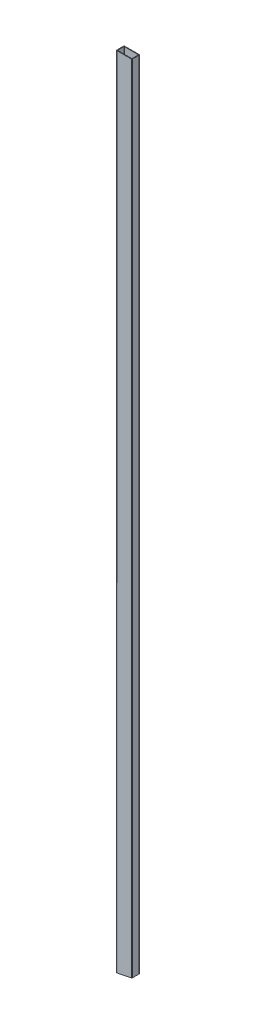
ISO-10303-21;
HEADER;
FILE_DESCRIPTION(('STEP AP214'),'2;1');
FILE_NAME('part.step','',(''),(''),'','','');
FILE_SCHEMA(('AUTOMOTIVE_DESIGN { 1 0 10303 214 1 1 1 1 }'));
ENDSEC;
DATA;
#1=APPLICATION_CONTEXT('core data for automotive mechanical design processes');
#2=APPLICATION_PROTOCOL_DEFINITION('international standard','automotive_design',2000,#1);
#3=PRODUCT_CONTEXT('',#1,'mechanical');
#4=PRODUCT('Part','Part','',(#3));
#5=PRODUCT_RELATED_PRODUCT_CATEGORY('part','',(#4));
#6=PRODUCT_DEFINITION_FORMATION('','',#4);
#7=PRODUCT_DEFINITION_CONTEXT('part definition',#1,'design');
#8=PRODUCT_DEFINITION('design','',#6,#7);
#9=PRODUCT_DEFINITION_SHAPE('','',#8);
#10=(LENGTH_UNIT() NAMED_UNIT(*) SI_UNIT(.MILLI.,.METRE.));
#11=(NAMED_UNIT(*) PLANE_ANGLE_UNIT() SI_UNIT($,.RADIAN.));
#12=(NAMED_UNIT(*) SI_UNIT($,.STERADIAN.) SOLID_ANGLE_UNIT());
#13=UNCERTAINTY_MEASURE_WITH_UNIT(LENGTH_MEASURE(1.E-05),#10,'distance_accuracy_value','');
#14=(GEOMETRIC_REPRESENTATION_CONTEXT(3) GLOBAL_UNCERTAINTY_ASSIGNED_CONTEXT((#13)) GLOBAL_UNIT_ASSIGNED_CONTEXT((#10,
#11,#12)) REPRESENTATION_CONTEXT('',''));
#15=CARTESIAN_POINT('',(0.,0.,0.));
#16=DIRECTION('',(0.,0.,1.));
#17=DIRECTION('',(1.,0.,0.));
#18=AXIS2_PLACEMENT_3D('',#15,#16,#17);
#19=CARTESIAN_POINT('',(-1.50000000000003,2039.60780543711,8.49999999999993));
#20=DIRECTION('',(0.,-1.,0.));
#21=DIRECTION('',(0.,0.,-1.));
#22=AXIS2_PLACEMENT_3D('',#19,#20,#21);
#23=PLANE('',#22);
#24=CARTESIAN_POINT('',(-1.50000000000003,2039.60780543711,8.49999999999993));
#25=DIRECTION('',(0.,1.,0.));
#26=DIRECTION('',(0.,0.,-1.));
#27=AXIS2_PLACEMENT_3D('',#24,#25,#26);
#28=CIRCLE('',#27,1.5);
#29=CARTESIAN_POINT('',(-1.50000000000003,2039.60780543711,9.99999999999993));
#30=VERTEX_POINT('',#29);
#31=CARTESIAN_POINT('',(0.,2039.60780543711,8.49999999999991));
#32=VERTEX_POINT('',#31);
#33=EDGE_CURVE('E134',#30,#32,#28,.T.);
#34=ORIENTED_EDGE('',*,*,#33,.T.);
#35=DIRECTION('',(0.,0.,-1.));
#36=VECTOR('',#35,1.);
#37=CARTESIAN_POINT('',(0.,2039.60780543711,-8.50000000000007));
#38=LINE('',#37,#36);
#39=CARTESIAN_POINT('',(0.,2039.60780543711,-8.50000000000007));
#40=VERTEX_POINT('',#39);
#41=EDGE_CURVE('E155',#32,#40,#38,.T.);
#42=ORIENTED_EDGE('',*,*,#41,.T.);
#43=CARTESIAN_POINT('',(-1.50000000000003,2039.60780543711,-8.50000000000007));
#44=DIRECTION('',(0.,1.,0.));
#45=DIRECTION('',(0.,0.,-1.));
#46=AXIS2_PLACEMENT_3D('',#43,#44,#45);
#47=CIRCLE('',#46,1.50000000000001);
#48=CARTESIAN_POINT('',(-1.50000000000003,2039.60780543711,-10.0000000000001));
#49=VERTEX_POINT('',#48);
#50=EDGE_CURVE('E152',#40,#49,#47,.T.);
#51=ORIENTED_EDGE('',*,*,#50,.T.);
#52=DIRECTION('',(-1.,0.,0.));
#53=VECTOR('',#52,1.);
#54=CARTESIAN_POINT('',(-1.50000000000003,2039.60780543711,-10.0000000000001));
#55=LINE('',#54,#53);
#56=CARTESIAN_POINT('',(-38.5,2039.60780543711,-10.0000000000001));
#57=VERTEX_POINT('',#56);
#58=EDGE_CURVE('E223',#49,#57,#55,.T.);
#59=ORIENTED_EDGE('',*,*,#58,.T.);
#60=CARTESIAN_POINT('',(-38.5,2039.60780543711,-8.50000000000007));
#61=DIRECTION('',(0.,1.,0.));
#62=DIRECTION('',(0.,0.,1.));
#63=AXIS2_PLACEMENT_3D('',#60,#61,#62);
#64=CIRCLE('',#63,1.5);
#65=CARTESIAN_POINT('',(-40.,2039.60780543711,-8.50000000000007));
#66=VERTEX_POINT('',#65);
#67=EDGE_CURVE('E107',#57,#66,#64,.T.);
#68=ORIENTED_EDGE('',*,*,#67,.T.);
#69=DIRECTION('',(0.,0.,1.));
#70=VECTOR('',#69,1.);
#71=CARTESIAN_POINT('',(-40.,2039.60780543711,-8.50000000000007));
#72=LINE('',#71,#70);
#73=CARTESIAN_POINT('',(-40.,2039.60780543711,8.49999999999991));
#74=VERTEX_POINT('',#73);
#75=EDGE_CURVE('E100',#66,#74,#72,.T.);
#76=ORIENTED_EDGE('',*,*,#75,.T.);
#77=CARTESIAN_POINT('',(-38.5,2039.60780543711,8.49999999999994));
#78=DIRECTION('',(0.,1.,0.));
#79=DIRECTION('',(0.,0.,-1.));
#80=AXIS2_PLACEMENT_3D('',#77,#78,#79);
#81=CIRCLE('',#80,1.5);
#82=CARTESIAN_POINT('',(-38.5,2039.60780543711,9.99999999999994));
#83=VERTEX_POINT('',#82);
#84=EDGE_CURVE('E104',#74,#83,#81,.T.);
#85=ORIENTED_EDGE('',*,*,#84,.T.);
#86=DIRECTION('',(1.,0.,0.));
#87=VECTOR('',#86,1.);
#88=CARTESIAN_POINT('',(-1.50000000000003,2039.60780543711,9.99999999999993));
#89=LINE('',#88,#87);
#90=EDGE_CURVE('E59',#83,#30,#89,.T.);
#91=ORIENTED_EDGE('',*,*,#90,.T.);
#92=EDGE_LOOP('',(#34,#42,#51,#59,#68,#76,#85,#91));
#93=FACE_BOUND('',#92,.T.);
#94=CARTESIAN_POINT('',(-37.5,2039.60780543711,7.49999999999994));
#95=DIRECTION('',(0.,1.,0.));
#96=DIRECTION('',(0.,0.,-1.));
#97=AXIS2_PLACEMENT_3D('',#94,#95,#96);
#98=CIRCLE('',#97,0.999999999999994);
#99=CARTESIAN_POINT('',(-38.5,2039.60780543711,7.49999999999994));
#100=VERTEX_POINT('',#99);
#101=CARTESIAN_POINT('',(-37.5,2039.60780543711,8.49999999999994));
#102=VERTEX_POINT('',#101);
#103=EDGE_CURVE('E170',#100,#102,#98,.T.);
#104=ORIENTED_EDGE('',*,*,#103,.F.);
#105=DIRECTION('',(0.,0.,1.));
#106=VECTOR('',#105,1.);
#107=CARTESIAN_POINT('',(-38.5,2039.60780543711,-7.50000000000007));
#108=LINE('',#107,#106);
#109=CARTESIAN_POINT('',(-38.5,2039.60780543711,-7.50000000000007));
#110=VERTEX_POINT('',#109);
#111=EDGE_CURVE('E81',#110,#100,#108,.T.);
#112=ORIENTED_EDGE('',*,*,#111,.F.);
#113=CARTESIAN_POINT('',(-37.5,2039.60780543711,-7.50000000000007));
#114=DIRECTION('',(0.,1.,0.));
#115=DIRECTION('',(0.,0.,1.));
#116=AXIS2_PLACEMENT_3D('',#113,#114,#115);
#117=CIRCLE('',#116,0.999999999999997);
#118=CARTESIAN_POINT('',(-37.5,2039.60780543711,-8.50000000000006));
#119=VERTEX_POINT('',#118);
#120=EDGE_CURVE('E197',#119,#110,#117,.T.);
#121=ORIENTED_EDGE('',*,*,#120,.F.);
#122=DIRECTION('',(-1.,0.,0.));
#123=VECTOR('',#122,1.);
#124=CARTESIAN_POINT('',(-2.50000000000003,2039.60780543711,-8.50000000000007));
#125=LINE('',#124,#123);
#126=CARTESIAN_POINT('',(-2.50000000000003,2039.60780543711,-8.50000000000007));
#127=VERTEX_POINT('',#126);
#128=EDGE_CURVE('E195',#127,#119,#125,.T.);
#129=ORIENTED_EDGE('',*,*,#128,.F.);
#130=CARTESIAN_POINT('',(-2.50000000000003,2039.60780543711,-7.50000000000007));
#131=DIRECTION('',(0.,1.,0.));
#132=DIRECTION('',(0.,0.,-1.));
#133=AXIS2_PLACEMENT_3D('',#130,#131,#132);
#134=CIRCLE('',#133,1.);
#135=CARTESIAN_POINT('',(-1.50000000000003,2039.60780543711,-7.50000000000007));
#136=VERTEX_POINT('',#135);
#137=EDGE_CURVE('E192',#136,#127,#134,.T.);
#138=ORIENTED_EDGE('',*,*,#137,.F.);
#139=DIRECTION('',(0.,0.,-1.));
#140=VECTOR('',#139,1.);
#141=CARTESIAN_POINT('',(-1.50000000000003,2039.60780543711,-7.50000000000007));
#142=LINE('',#141,#140);
#143=CARTESIAN_POINT('',(-1.50000000000003,2039.60780543711,7.49999999999993));
#144=VERTEX_POINT('',#143);
#145=EDGE_CURVE('E189',#144,#136,#142,.T.);
#146=ORIENTED_EDGE('',*,*,#145,.F.);
#147=CARTESIAN_POINT('',(-2.50000000000003,2039.60780543711,7.49999999999993));
#148=DIRECTION('',(0.,1.,0.));
#149=DIRECTION('',(0.,0.,-1.));
#150=AXIS2_PLACEMENT_3D('',#147,#148,#149);
#151=CIRCLE('',#150,1.);
#152=CARTESIAN_POINT('',(-2.50000000000003,2039.60780543711,8.49999999999993));
#153=VERTEX_POINT('',#152);
#154=EDGE_CURVE('E186',#153,#144,#151,.T.);
#155=ORIENTED_EDGE('',*,*,#154,.F.);
#156=DIRECTION('',(1.,0.,0.));
#157=VECTOR('',#156,1.);
#158=CARTESIAN_POINT('',(-2.50000000000003,2039.60780543711,8.49999999999993));
#159=LINE('',#158,#157);
#160=EDGE_CURVE('E174',#102,#153,#159,.T.);
#161=ORIENTED_EDGE('',*,*,#160,.F.);
#162=EDGE_LOOP('',(#104,#112,#121,#129,#138,#146,#155,#161));
#163=FACE_BOUND('',#162,.T.);
#164=ADVANCED_FACE('F35',(#93,#163),#23,.F.);
#165=CARTESIAN_POINT('',(-1.50000000000003,2039.60780543711,8.49999999999993));
#166=DIRECTION('',(0.,-1.,0.));
#167=DIRECTION('',(0.,0.,-1.));
#168=AXIS2_PLACEMENT_3D('',#165,#166,#167);
#169=CYLINDRICAL_SURFACE('',#168,1.5);
#170=DIRECTION('',(0.,-1.,0.));
#171=VECTOR('',#170,1.);
#172=CARTESIAN_POINT('',(-1.50000000000003,2039.60780543711,9.99999999999993));
#173=LINE('',#172,#171);
#174=CARTESIAN_POINT('',(-1.50000000000003,-0.300000000000049,9.99999999999993));
#175=VERTEX_POINT('',#174);
#176=EDGE_CURVE('E128',#30,#175,#173,.T.);
#177=ORIENTED_EDGE('',*,*,#176,.T.);
#178=CARTESIAN_POINT('',(-1.50000000000003,-0.300000000000057,8.49999999999993));
#179=DIRECTION('',(-0.196116135138184,0.98058067569092,0.));
#180=DIRECTION('',(0.98058067569092,0.196116135138184,0.));
#181=AXIS2_PLACEMENT_3D('',#178,#179,#180);
#182=ELLIPSE('',#181,1.52970585407784,1.5);
#183=CARTESIAN_POINT('',(2.5283594662362E-13,0.,8.49999999999993));
#184=VERTEX_POINT('',#183);
#185=EDGE_CURVE('E164',#184,#175,#182,.F.);
#186=ORIENTED_EDGE('',*,*,#185,.F.);
#187=DIRECTION('',(0.,-1.,0.));
#188=VECTOR('',#187,1.);
#189=CARTESIAN_POINT('',(0.,2039.60780543711,8.49999999999991));
#190=LINE('',#189,#188);
#191=EDGE_CURVE('E11',#32,#184,#190,.T.);
#192=ORIENTED_EDGE('',*,*,#191,.F.);
#193=ORIENTED_EDGE('',*,*,#33,.F.);
#194=EDGE_LOOP('',(#177,#186,#192,#193));
#195=FACE_BOUND('',#194,.T.);
#196=ADVANCED_FACE('F37',(#195),#169,.T.);
#197=CARTESIAN_POINT('',(0.,2039.60780543711,-8.50000000000007));
#198=DIRECTION('',(-1.,0.,0.));
#199=DIRECTION('',(0.,0.,1.));
#200=AXIS2_PLACEMENT_3D('',#197,#198,#199);
#201=PLANE('',#200);
#202=DIRECTION('',(0.,0.,-1.));
#203=VECTOR('',#202,1.);
#204=CARTESIAN_POINT('',(0.,0.,-8.50000000000007));
#205=LINE('',#204,#203);
#206=CARTESIAN_POINT('',(0.,0.,-8.50000000000007));
#207=VERTEX_POINT('',#206);
#208=EDGE_CURVE('E132',#184,#207,#205,.T.);
#209=ORIENTED_EDGE('',*,*,#208,.T.);
#210=DIRECTION('',(0.,-1.,0.));
#211=VECTOR('',#210,1.);
#212=CARTESIAN_POINT('',(0.,2039.60780543711,-8.50000000000007));
#213=LINE('',#212,#211);
#214=EDGE_CURVE('E43',#40,#207,#213,.T.);
#215=ORIENTED_EDGE('',*,*,#214,.F.);
#216=ORIENTED_EDGE('',*,*,#41,.F.);
#217=ORIENTED_EDGE('',*,*,#191,.T.);
#218=EDGE_LOOP('',(#209,#215,#216,#217));
#219=FACE_BOUND('',#218,.T.);
#220=ADVANCED_FACE('F154',(#219),#201,.F.);
#221=CARTESIAN_POINT('',(-1.50000000000003,2039.60780543711,-8.50000000000007));
#222=DIRECTION('',(0.,-1.,0.));
#223=DIRECTION('',(0.,0.,-1.));
#224=AXIS2_PLACEMENT_3D('',#221,#222,#223);
#225=CYLINDRICAL_SURFACE('',#224,1.50000000000001);
#226=ORIENTED_EDGE('',*,*,#214,.T.);
#227=CARTESIAN_POINT('',(-1.50000000000003,-0.300000000000057,-8.50000000000007));
#228=DIRECTION('',(-0.196116135138184,0.98058067569092,0.));
#229=DIRECTION('',(0.98058067569092,0.196116135138184,0.));
#230=AXIS2_PLACEMENT_3D('',#227,#228,#229);
#231=ELLIPSE('',#230,1.52970585407784,1.50000000000001);
#232=CARTESIAN_POINT('',(-1.50000000000003,-0.300000000000057,-10.0000000000001));
#233=VERTEX_POINT('',#232);
#234=EDGE_CURVE('E72',#233,#207,#231,.F.);
#235=ORIENTED_EDGE('',*,*,#234,.F.);
#236=DIRECTION('',(0.,-1.,0.));
#237=VECTOR('',#236,1.);
#238=CARTESIAN_POINT('',(-1.50000000000003,2039.60780543711,-10.0000000000001));
#239=LINE('',#238,#237);
#240=EDGE_CURVE('E143',#49,#233,#239,.T.);
#241=ORIENTED_EDGE('',*,*,#240,.F.);
#242=ORIENTED_EDGE('',*,*,#50,.F.);
#243=EDGE_LOOP('',(#226,#235,#241,#242));
#244=FACE_BOUND('',#243,.T.);
#245=ADVANCED_FACE('F149',(#244),#225,.T.);
#246=CARTESIAN_POINT('',(-1.50000000000003,2039.60780543711,-10.0000000000001));
#247=DIRECTION('',(0.,0.,1.));
#248=DIRECTION('',(1.,0.,0.));
#249=AXIS2_PLACEMENT_3D('',#246,#247,#248);
#250=PLANE('',#249);
#251=ORIENTED_EDGE('',*,*,#240,.T.);
#252=DIRECTION('',(0.98058067569092,0.196116135138184,0.));
#253=VECTOR('',#252,1.);
#254=CARTESIAN_POINT('',(-10.8969592840348,-2.179391856807,-10.0000000000001));
#255=LINE('',#254,#253);
#256=CARTESIAN_POINT('',(-38.5,-7.70000000000005,-10.0000000000001));
#257=VERTEX_POINT('',#256);
#258=EDGE_CURVE('E230',#257,#233,#255,.T.);
#259=ORIENTED_EDGE('',*,*,#258,.F.);
#260=DIRECTION('',(0.,-1.,0.));
#261=VECTOR('',#260,1.);
#262=CARTESIAN_POINT('',(-38.5,2039.60780543711,-10.0000000000001));
#263=LINE('',#262,#261);
#264=EDGE_CURVE('E140',#57,#257,#263,.T.);
#265=ORIENTED_EDGE('',*,*,#264,.F.);
#266=ORIENTED_EDGE('',*,*,#58,.F.);
#267=EDGE_LOOP('',(#251,#259,#265,#266));
#268=FACE_BOUND('',#267,.T.);
#269=ADVANCED_FACE('F228',(#268),#250,.F.);
#270=CARTESIAN_POINT('',(-38.5,2039.60780543711,-8.50000000000007));
#271=DIRECTION('',(0.,-1.,0.));
#272=DIRECTION('',(0.,0.,-1.));
#273=AXIS2_PLACEMENT_3D('',#270,#271,#272);
#274=CYLINDRICAL_SURFACE('',#273,1.5);
#275=ORIENTED_EDGE('',*,*,#264,.T.);
#276=CARTESIAN_POINT('',(-38.5,-7.70000000000004,-8.50000000000007));
#277=DIRECTION('',(-0.196116135138184,0.98058067569092,0.));
#278=DIRECTION('',(0.98058067569092,0.196116135138184,0.));
#279=AXIS2_PLACEMENT_3D('',#276,#277,#278);
#280=ELLIPSE('',#279,1.52970585407784,1.5);
#281=CARTESIAN_POINT('',(-40.,-8.00000000000004,-8.50000000000007));
#282=VERTEX_POINT('',#281);
#283=EDGE_CURVE('E236',#282,#257,#280,.F.);
#284=ORIENTED_EDGE('',*,*,#283,.F.);
#285=DIRECTION('',(0.,-1.,0.));
#286=VECTOR('',#285,1.);
#287=CARTESIAN_POINT('',(-40.,2039.60780543711,-8.50000000000007));
#288=LINE('',#287,#286);
#289=EDGE_CURVE('E122',#66,#282,#288,.T.);
#290=ORIENTED_EDGE('',*,*,#289,.F.);
#291=ORIENTED_EDGE('',*,*,#67,.F.);
#292=EDGE_LOOP('',(#275,#284,#290,#291));
#293=FACE_BOUND('',#292,.T.);
#294=ADVANCED_FACE('F234',(#293),#274,.T.);
#295=CARTESIAN_POINT('',(-40.,2039.60780543711,-8.50000000000007));
#296=DIRECTION('',(1.,0.,0.));
#297=DIRECTION('',(0.,0.,-1.));
#298=AXIS2_PLACEMENT_3D('',#295,#296,#297);
#299=PLANE('',#298);
#300=ORIENTED_EDGE('',*,*,#289,.T.);
#301=DIRECTION('',(0.,0.,-1.));
#302=VECTOR('',#301,1.);
#303=CARTESIAN_POINT('',(-40.,-8.00000000000006,-8.50000000000007));
#304=LINE('',#303,#302);
#305=CARTESIAN_POINT('',(-40.,-8.00000000000006,8.49999999999991));
#306=VERTEX_POINT('',#305);
#307=EDGE_CURVE('E118',#306,#282,#304,.T.);
#308=ORIENTED_EDGE('',*,*,#307,.F.);
#309=DIRECTION('',(0.,-1.,0.));
#310=VECTOR('',#309,1.);
#311=CARTESIAN_POINT('',(-40.,2039.60780543711,8.49999999999991));
#312=LINE('',#311,#310);
#313=EDGE_CURVE('E114',#74,#306,#312,.T.);
#314=ORIENTED_EDGE('',*,*,#313,.F.);
#315=ORIENTED_EDGE('',*,*,#75,.F.);
#316=EDGE_LOOP('',(#300,#308,#314,#315));
#317=FACE_BOUND('',#316,.T.);
#318=ADVANCED_FACE('F115',(#317),#299,.F.);
#319=CARTESIAN_POINT('',(-38.5,2039.60780543711,8.49999999999994));
#320=DIRECTION('',(0.,-1.,0.));
#321=DIRECTION('',(0.,0.,-1.));
#322=AXIS2_PLACEMENT_3D('',#319,#320,#321);
#323=CYLINDRICAL_SURFACE('',#322,1.5);
#324=ORIENTED_EDGE('',*,*,#313,.T.);
#325=CARTESIAN_POINT('',(-38.5,-7.70000000000004,8.49999999999994));
#326=DIRECTION('',(-0.196116135138184,0.98058067569092,0.));
#327=DIRECTION('',(0.98058067569092,0.196116135138184,0.));
#328=AXIS2_PLACEMENT_3D('',#325,#326,#327);
#329=ELLIPSE('',#328,1.52970585407784,1.5);
#330=CARTESIAN_POINT('',(-38.5,-7.70000000000004,9.99999999999994));
#331=VERTEX_POINT('',#330);
#332=EDGE_CURVE('E176',#331,#306,#329,.F.);
#333=ORIENTED_EDGE('',*,*,#332,.F.);
#334=DIRECTION('',(0.,-1.,0.));
#335=VECTOR('',#334,1.);
#336=CARTESIAN_POINT('',(-38.5,2039.60780543711,9.99999999999994));
#337=LINE('',#336,#335);
#338=EDGE_CURVE('E123',#83,#331,#337,.T.);
#339=ORIENTED_EDGE('',*,*,#338,.F.);
#340=ORIENTED_EDGE('',*,*,#84,.F.);
#341=EDGE_LOOP('',(#324,#333,#339,#340));
#342=FACE_BOUND('',#341,.T.);
#343=ADVANCED_FACE('F125',(#342),#323,.T.);
#344=CARTESIAN_POINT('',(-1.50000000000003,2039.60780543711,9.99999999999993));
#345=DIRECTION('',(0.,0.,-1.));
#346=DIRECTION('',(-1.,0.,0.));
#347=AXIS2_PLACEMENT_3D('',#344,#345,#346);
#348=PLANE('',#347);
#349=ORIENTED_EDGE('',*,*,#338,.T.);
#350=DIRECTION('',(-0.98058067569092,-0.196116135138184,0.));
#351=VECTOR('',#350,1.);
#352=CARTESIAN_POINT('',(-10.8969592840348,-2.179391856807,9.99999999999993));
#353=LINE('',#352,#351);
#354=EDGE_CURVE('E171',#175,#331,#353,.T.);
#355=ORIENTED_EDGE('',*,*,#354,.F.);
#356=ORIENTED_EDGE('',*,*,#176,.F.);
#357=ORIENTED_EDGE('',*,*,#90,.F.);
#358=EDGE_LOOP('',(#349,#355,#356,#357));
#359=FACE_BOUND('',#358,.T.);
#360=ADVANCED_FACE('F327',(#359),#348,.F.);
#361=CARTESIAN_POINT('',(-37.5,2039.60780543711,7.49999999999994));
#362=DIRECTION('',(0.,-1.,0.));
#363=DIRECTION('',(0.,0.,-1.));
#364=AXIS2_PLACEMENT_3D('',#361,#362,#363);
#365=CYLINDRICAL_SURFACE('',#364,0.999999999999994);
#366=DIRECTION('',(0.,-1.,0.));
#367=VECTOR('',#366,1.);
#368=CARTESIAN_POINT('',(-37.5,2039.60780543711,8.49999999999994));
#369=LINE('',#368,#367);
#370=CARTESIAN_POINT('',(-37.5,-7.50000000000006,8.49999999999994));
#371=VERTEX_POINT('',#370);
#372=EDGE_CURVE('E135',#102,#371,#369,.T.);
#373=ORIENTED_EDGE('',*,*,#372,.T.);
#374=CARTESIAN_POINT('',(-37.5,-7.50000000000003,7.49999999999994));
#375=DIRECTION('',(-0.196116135138184,0.98058067569092,0.));
#376=DIRECTION('',(0.98058067569092,0.196116135138184,0.));
#377=AXIS2_PLACEMENT_3D('',#374,#375,#376);
#378=ELLIPSE('',#377,1.01980390271855,0.999999999999994);
#379=CARTESIAN_POINT('',(-38.5,-7.70000000000004,7.49999999999993));
#380=VERTEX_POINT('',#379);
#381=EDGE_CURVE('E182',#371,#380,#378,.F.);
#382=ORIENTED_EDGE('',*,*,#381,.T.);
#383=DIRECTION('',(0.,-1.,0.));
#384=VECTOR('',#383,1.);
#385=CARTESIAN_POINT('',(-38.5,2039.60780543711,7.49999999999994));
#386=LINE('',#385,#384);
#387=EDGE_CURVE('E200',#100,#380,#386,.T.);
#388=ORIENTED_EDGE('',*,*,#387,.F.);
#389=ORIENTED_EDGE('',*,*,#103,.T.);
#390=EDGE_LOOP('',(#373,#382,#388,#389));
#391=FACE_BOUND('',#390,.T.);
#392=ADVANCED_FACE('F310',(#391),#365,.F.);
#393=CARTESIAN_POINT('',(-2.50000000000003,2039.60780543711,8.49999999999993));
#394=DIRECTION('',(0.,0.,-1.));
#395=DIRECTION('',(-1.,0.,0.));
#396=AXIS2_PLACEMENT_3D('',#393,#394,#395);
#397=PLANE('',#396);
#398=DIRECTION('',(0.,-1.,0.));
#399=VECTOR('',#398,1.);
#400=CARTESIAN_POINT('',(-2.50000000000003,2039.60780543711,8.49999999999993));
#401=LINE('',#400,#399);
#402=CARTESIAN_POINT('',(-2.50000000000003,-0.500000000000057,8.49999999999993));
#403=VERTEX_POINT('',#402);
#404=EDGE_CURVE('E215',#153,#403,#401,.T.);
#405=ORIENTED_EDGE('',*,*,#404,.T.);
#406=DIRECTION('',(-0.98058067569092,-0.196116135138184,0.));
#407=VECTOR('',#406,1.);
#408=CARTESIAN_POINT('',(-11.8584977455732,-2.3716995491147,8.49999999999993));
#409=LINE('',#408,#407);
#410=EDGE_CURVE('E180',#403,#371,#409,.T.);
#411=ORIENTED_EDGE('',*,*,#410,.T.);
#412=ORIENTED_EDGE('',*,*,#372,.F.);
#413=ORIENTED_EDGE('',*,*,#160,.T.);
#414=EDGE_LOOP('',(#405,#411,#412,#413));
#415=FACE_BOUND('',#414,.T.);
#416=ADVANCED_FACE('F315',(#415),#397,.T.);
#417=CARTESIAN_POINT('',(-2.50000000000003,2039.60780543711,7.49999999999993));
#418=DIRECTION('',(0.,-1.,0.));
#419=DIRECTION('',(0.,0.,-1.));
#420=AXIS2_PLACEMENT_3D('',#417,#418,#419);
#421=CYLINDRICAL_SURFACE('',#420,1.);
#422=DIRECTION('',(0.,-1.,0.));
#423=VECTOR('',#422,1.);
#424=CARTESIAN_POINT('',(-1.50000000000003,2039.60780543711,7.49999999999993));
#425=LINE('',#424,#423);
#426=CARTESIAN_POINT('',(-1.50000000000003,-0.300000000000064,7.49999999999993));
#427=VERTEX_POINT('',#426);
#428=EDGE_CURVE('E212',#144,#427,#425,.T.);
#429=ORIENTED_EDGE('',*,*,#428,.T.);
#430=CARTESIAN_POINT('',(-2.50000000000003,-0.500000000000063,7.49999999999993));
#431=DIRECTION('',(-0.196116135138184,0.98058067569092,0.));
#432=DIRECTION('',(0.98058067569092,0.196116135138184,0.));
#433=AXIS2_PLACEMENT_3D('',#430,#431,#432);
#434=ELLIPSE('',#433,1.01980390271856,1.);
#435=EDGE_CURVE('E243',#427,#403,#434,.F.);
#436=ORIENTED_EDGE('',*,*,#435,.T.);
#437=ORIENTED_EDGE('',*,*,#404,.F.);
#438=ORIENTED_EDGE('',*,*,#154,.T.);
#439=EDGE_LOOP('',(#429,#436,#437,#438));
#440=FACE_BOUND('',#439,.T.);
#441=ADVANCED_FACE('F265',(#440),#421,.F.);
#442=CARTESIAN_POINT('',(-1.50000000000003,2039.60780543711,-7.50000000000007));
#443=DIRECTION('',(-1.,0.,0.));
#444=DIRECTION('',(0.,0.,1.));
#445=AXIS2_PLACEMENT_3D('',#442,#443,#444);
#446=PLANE('',#445);
#447=DIRECTION('',(0.,-1.,0.));
#448=VECTOR('',#447,1.);
#449=CARTESIAN_POINT('',(-1.50000000000003,2039.60780543711,-7.50000000000007));
#450=LINE('',#449,#448);
#451=CARTESIAN_POINT('',(-1.50000000000003,-0.300000000000057,-7.50000000000007));
#452=VERTEX_POINT('',#451);
#453=EDGE_CURVE('E209',#136,#452,#450,.T.);
#454=ORIENTED_EDGE('',*,*,#453,.T.);
#455=DIRECTION('',(0.,0.,1.));
#456=VECTOR('',#455,1.);
#457=CARTESIAN_POINT('',(-1.50000000000003,-0.300000000000057,-7.50000000000007));
#458=LINE('',#457,#456);
#459=EDGE_CURVE('E257',#452,#427,#458,.T.);
#460=ORIENTED_EDGE('',*,*,#459,.T.);
#461=ORIENTED_EDGE('',*,*,#428,.F.);
#462=ORIENTED_EDGE('',*,*,#145,.T.);
#463=EDGE_LOOP('',(#454,#460,#461,#462));
#464=FACE_BOUND('',#463,.T.);
#465=ADVANCED_FACE('F279',(#464),#446,.T.);
#466=CARTESIAN_POINT('',(-2.50000000000003,2039.60780543711,-7.50000000000007));
#467=DIRECTION('',(0.,-1.,0.));
#468=DIRECTION('',(0.,0.,-1.));
#469=AXIS2_PLACEMENT_3D('',#466,#467,#468);
#470=CYLINDRICAL_SURFACE('',#469,1.);
#471=DIRECTION('',(0.,-1.,0.));
#472=VECTOR('',#471,1.);
#473=CARTESIAN_POINT('',(-2.50000000000003,2039.60780543711,-8.50000000000007));
#474=LINE('',#473,#472);
#475=CARTESIAN_POINT('',(-2.50000000000003,-0.500000000000063,-8.50000000000007));
#476=VERTEX_POINT('',#475);
#477=EDGE_CURVE('E206',#127,#476,#474,.T.);
#478=ORIENTED_EDGE('',*,*,#477,.T.);
#479=CARTESIAN_POINT('',(-2.50000000000003,-0.500000000000063,-7.50000000000007));
#480=DIRECTION('',(-0.196116135138184,0.98058067569092,0.));
#481=DIRECTION('',(0.98058067569092,0.196116135138184,0.));
#482=AXIS2_PLACEMENT_3D('',#479,#480,#481);
#483=ELLIPSE('',#482,1.01980390271856,1.);
#484=EDGE_CURVE('E254',#476,#452,#483,.F.);
#485=ORIENTED_EDGE('',*,*,#484,.T.);
#486=ORIENTED_EDGE('',*,*,#453,.F.);
#487=ORIENTED_EDGE('',*,*,#137,.T.);
#488=EDGE_LOOP('',(#478,#485,#486,#487));
#489=FACE_BOUND('',#488,.T.);
#490=ADVANCED_FACE('F288',(#489),#470,.F.);
#491=CARTESIAN_POINT('',(-2.50000000000003,2039.60780543711,-8.50000000000007));
#492=DIRECTION('',(0.,0.,1.));
#493=DIRECTION('',(1.,0.,0.));
#494=AXIS2_PLACEMENT_3D('',#491,#492,#493);
#495=PLANE('',#494);
#496=DIRECTION('',(0.,-1.,0.));
#497=VECTOR('',#496,1.);
#498=CARTESIAN_POINT('',(-37.5,2039.60780543711,-8.50000000000006));
#499=LINE('',#498,#497);
#500=CARTESIAN_POINT('',(-37.5,-7.50000000000005,-8.50000000000006));
#501=VERTEX_POINT('',#500);
#502=EDGE_CURVE('E203',#119,#501,#499,.T.);
#503=ORIENTED_EDGE('',*,*,#502,.T.);
#504=DIRECTION('',(0.98058067569092,0.196116135138184,0.));
#505=VECTOR('',#504,1.);
#506=CARTESIAN_POINT('',(-11.8584977455732,-2.3716995491147,-8.50000000000006));
#507=LINE('',#506,#505);
#508=EDGE_CURVE('E251',#501,#476,#507,.T.);
#509=ORIENTED_EDGE('',*,*,#508,.T.);
#510=ORIENTED_EDGE('',*,*,#477,.F.);
#511=ORIENTED_EDGE('',*,*,#128,.T.);
#512=EDGE_LOOP('',(#503,#509,#510,#511));
#513=FACE_BOUND('',#512,.T.);
#514=ADVANCED_FACE('F296',(#513),#495,.T.);
#515=CARTESIAN_POINT('',(-37.5,2039.60780543711,-7.50000000000007));
#516=DIRECTION('',(0.,-1.,0.));
#517=DIRECTION('',(0.,0.,-1.));
#518=AXIS2_PLACEMENT_3D('',#515,#516,#517);
#519=CYLINDRICAL_SURFACE('',#518,0.999999999999997);
#520=DIRECTION('',(0.,-1.,0.));
#521=VECTOR('',#520,1.);
#522=CARTESIAN_POINT('',(-38.5,2039.60780543711,-7.50000000000007));
#523=LINE('',#522,#521);
#524=CARTESIAN_POINT('',(-38.5,-7.70000000000003,-7.50000000000007));
#525=VERTEX_POINT('',#524);
#526=EDGE_CURVE('E50',#110,#525,#523,.T.);
#527=ORIENTED_EDGE('',*,*,#526,.T.);
#528=CARTESIAN_POINT('',(-37.5,-7.50000000000003,-7.50000000000007));
#529=DIRECTION('',(-0.196116135138184,0.98058067569092,0.));
#530=DIRECTION('',(0.98058067569092,0.196116135138184,0.));
#531=AXIS2_PLACEMENT_3D('',#528,#529,#530);
#532=ELLIPSE('',#531,1.01980390271855,0.999999999999997);
#533=EDGE_CURVE('E248',#525,#501,#532,.F.);
#534=ORIENTED_EDGE('',*,*,#533,.T.);
#535=ORIENTED_EDGE('',*,*,#502,.F.);
#536=ORIENTED_EDGE('',*,*,#120,.T.);
#537=EDGE_LOOP('',(#527,#534,#535,#536));
#538=FACE_BOUND('',#537,.T.);
#539=ADVANCED_FACE('F300',(#538),#519,.F.);
#540=CARTESIAN_POINT('',(-38.5,2039.60780543711,-7.50000000000007));
#541=DIRECTION('',(1.,0.,0.));
#542=DIRECTION('',(0.,0.,-1.));
#543=AXIS2_PLACEMENT_3D('',#540,#541,#542);
#544=PLANE('',#543);
#545=ORIENTED_EDGE('',*,*,#387,.T.);
#546=DIRECTION('',(0.,0.,-1.));
#547=VECTOR('',#546,1.);
#548=CARTESIAN_POINT('',(-38.5,-7.70000000000004,-7.50000000000007));
#549=LINE('',#548,#547);
#550=EDGE_CURVE('E246',#380,#525,#549,.T.);
#551=ORIENTED_EDGE('',*,*,#550,.T.);
#552=ORIENTED_EDGE('',*,*,#526,.F.);
#553=ORIENTED_EDGE('',*,*,#111,.T.);
#554=EDGE_LOOP('',(#545,#551,#552,#553));
#555=FACE_BOUND('',#554,.T.);
#556=ADVANCED_FACE('F307',(#555),#544,.T.);
#557=CARTESIAN_POINT('',(-588.348405414552,-117.66968108291,0.));
#558=DIRECTION('',(-0.196116135138184,0.98058067569092,0.));
#559=DIRECTION('',(-0.98058067569092,-0.196116135138184,0.));
#560=AXIS2_PLACEMENT_3D('',#557,#558,#559);
#561=PLANE('',#560);
#562=ORIENTED_EDGE('',*,*,#185,.T.);
#563=ORIENTED_EDGE('',*,*,#354,.T.);
#564=ORIENTED_EDGE('',*,*,#332,.T.);
#565=ORIENTED_EDGE('',*,*,#307,.T.);
#566=ORIENTED_EDGE('',*,*,#283,.T.);
#567=ORIENTED_EDGE('',*,*,#258,.T.);
#568=ORIENTED_EDGE('',*,*,#234,.T.);
#569=ORIENTED_EDGE('',*,*,#208,.F.);
#570=EDGE_LOOP('',(#562,#563,#564,#565,#566,#567,#568,#569));
#571=FACE_BOUND('',#570,.T.);
#572=ORIENTED_EDGE('',*,*,#410,.F.);
#573=ORIENTED_EDGE('',*,*,#435,.F.);
#574=ORIENTED_EDGE('',*,*,#459,.F.);
#575=ORIENTED_EDGE('',*,*,#484,.F.);
#576=ORIENTED_EDGE('',*,*,#508,.F.);
#577=ORIENTED_EDGE('',*,*,#533,.F.);
#578=ORIENTED_EDGE('',*,*,#550,.F.);
#579=ORIENTED_EDGE('',*,*,#381,.F.);
#580=EDGE_LOOP('',(#572,#573,#574,#575,#576,#577,#578,#579));
#581=FACE_BOUND('',#580,.T.);
#582=ADVANCED_FACE('F160',(#571,#581),#561,.F.);
#583=CLOSED_SHELL('',(#164,#196,#220,#245,#269,#294,#318,#343,#360,#392,#416,#441,#465,#490,
#514,#539,#556,#582));
#584=MANIFOLD_SOLID_BREP('B2',#583);
#585=ADVANCED_BREP_SHAPE_REPRESENTATION('',(#18,#584),#14);
#586=SHAPE_DEFINITION_REPRESENTATION(#9,#585);
ENDSEC;
END-ISO-10303-21;
